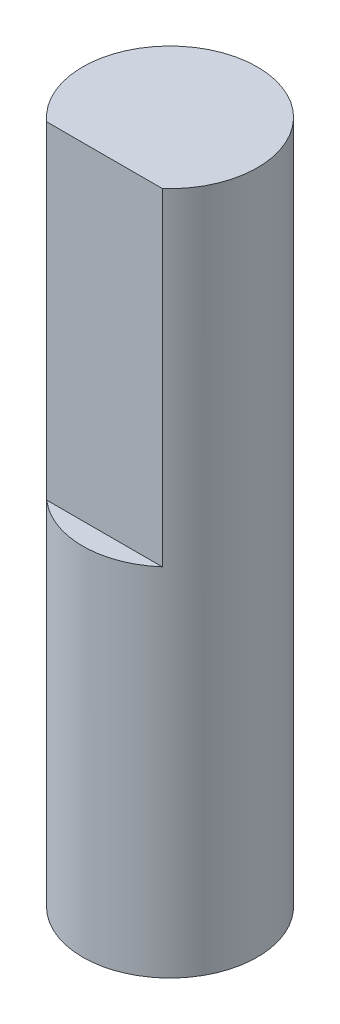
ISO-10303-21;
HEADER;
FILE_DESCRIPTION(('STEP AP214'),'2;1');
FILE_NAME('part.step','',(''),(''),'','','');
FILE_SCHEMA(('AUTOMOTIVE_DESIGN { 1 0 10303 214 1 1 1 1 }'));
ENDSEC;
DATA;
#1=APPLICATION_CONTEXT('core data for automotive mechanical design processes');
#2=APPLICATION_PROTOCOL_DEFINITION('international standard','automotive_design',2000,#1);
#3=PRODUCT_CONTEXT('',#1,'mechanical');
#4=PRODUCT('Part','Part','',(#3));
#5=PRODUCT_RELATED_PRODUCT_CATEGORY('part','',(#4));
#6=PRODUCT_DEFINITION_FORMATION('','',#4);
#7=PRODUCT_DEFINITION_CONTEXT('part definition',#1,'design');
#8=PRODUCT_DEFINITION('design','',#6,#7);
#9=PRODUCT_DEFINITION_SHAPE('','',#8);
#10=(LENGTH_UNIT() NAMED_UNIT(*) SI_UNIT(.MILLI.,.METRE.));
#11=(NAMED_UNIT(*) PLANE_ANGLE_UNIT() SI_UNIT($,.RADIAN.));
#12=(NAMED_UNIT(*) SI_UNIT($,.STERADIAN.) SOLID_ANGLE_UNIT());
#13=UNCERTAINTY_MEASURE_WITH_UNIT(LENGTH_MEASURE(1.E-05),#10,'distance_accuracy_value','');
#14=(GEOMETRIC_REPRESENTATION_CONTEXT(3) GLOBAL_UNCERTAINTY_ASSIGNED_CONTEXT((#13)) GLOBAL_UNIT_ASSIGNED_CONTEXT((#10,
#11,#12)) REPRESENTATION_CONTEXT('',''));
#15=CARTESIAN_POINT('',(0.,0.,0.));
#16=DIRECTION('',(0.,0.,1.));
#17=DIRECTION('',(1.,0.,0.));
#18=AXIS2_PLACEMENT_3D('',#15,#16,#17);
#19=CARTESIAN_POINT('',(0.,31.3,0.));
#20=DIRECTION('',(0.,-1.,0.));
#21=DIRECTION('',(0.,0.,-1.));
#22=AXIS2_PLACEMENT_3D('',#19,#20,#21);
#23=CYLINDRICAL_SURFACE('',#22,4.);
#24=CARTESIAN_POINT('',(0.,31.3,0.));
#25=DIRECTION('',(0.,1.,0.));
#26=DIRECTION('',(0.,0.,1.));
#27=AXIS2_PLACEMENT_3D('',#24,#25,#26);
#28=CIRCLE('',#27,4.);
#29=CARTESIAN_POINT('',(2.64575131106459,31.3,3.));
#30=VERTEX_POINT('',#29);
#31=CARTESIAN_POINT('',(-2.64575131106459,31.3,3.));
#32=VERTEX_POINT('',#31);
#33=EDGE_CURVE('E11',#30,#32,#28,.T.);
#34=ORIENTED_EDGE('',*,*,#33,.F.);
#35=DIRECTION('',(0.,1.,0.));
#36=VECTOR('',#35,1.);
#37=CARTESIAN_POINT('',(2.64575131106459,16.3,3.));
#38=LINE('',#37,#36);
#39=CARTESIAN_POINT('',(2.64575131106459,16.3,3.));
#40=VERTEX_POINT('',#39);
#41=EDGE_CURVE('E53',#40,#30,#38,.T.);
#42=ORIENTED_EDGE('',*,*,#41,.F.);
#43=CARTESIAN_POINT('',(0.,16.3,0.));
#44=DIRECTION('',(0.,1.,0.));
#45=DIRECTION('',(0.,0.,1.));
#46=AXIS2_PLACEMENT_3D('',#43,#44,#45);
#47=CIRCLE('',#46,4.);
#48=CARTESIAN_POINT('',(-2.64575131106459,16.3,3.));
#49=VERTEX_POINT('',#48);
#50=EDGE_CURVE('E68',#49,#40,#47,.T.);
#51=ORIENTED_EDGE('',*,*,#50,.F.);
#52=DIRECTION('',(0.,1.,0.));
#53=VECTOR('',#52,1.);
#54=CARTESIAN_POINT('',(-2.64575131106459,16.3,3.));
#55=LINE('',#54,#53);
#56=EDGE_CURVE('E59',#49,#32,#55,.T.);
#57=ORIENTED_EDGE('',*,*,#56,.T.);
#58=EDGE_LOOP('',(#34,#42,#51,#57));
#59=FACE_BOUND('',#58,.T.);
#60=CARTESIAN_POINT('',(0.,0.,0.));
#61=DIRECTION('',(0.,1.,0.));
#62=DIRECTION('',(0.,0.,1.));
#63=AXIS2_PLACEMENT_3D('',#60,#61,#62);
#64=CIRCLE('',#63,4.);
#65=CARTESIAN_POINT('',(0.,0.,4.));
#66=VERTEX_POINT('',#65);
#67=EDGE_CURVE('E42',#66,#66,#64,.T.);
#68=ORIENTED_EDGE('',*,*,#67,.T.);
#69=EDGE_LOOP('',(#68));
#70=FACE_BOUND('',#69,.T.);
#71=ADVANCED_FACE('F39',(#59,#70),#23,.T.);
#72=CARTESIAN_POINT('',(0.,31.3,0.));
#73=DIRECTION('',(0.,1.,0.));
#74=DIRECTION('',(0.,0.,1.));
#75=AXIS2_PLACEMENT_3D('',#72,#73,#74);
#76=PLANE('',#75);
#77=DIRECTION('',(-1.,0.,0.));
#78=VECTOR('',#77,1.);
#79=CARTESIAN_POINT('',(-2.64575131106459,31.3,3.));
#80=LINE('',#79,#78);
#81=EDGE_CURVE('E64',#30,#32,#80,.T.);
#82=ORIENTED_EDGE('',*,*,#81,.F.);
#83=ORIENTED_EDGE('',*,*,#33,.T.);
#84=EDGE_LOOP('',(#82,#83));
#85=FACE_BOUND('',#84,.T.);
#86=ADVANCED_FACE('F74',(#85),#76,.T.);
#87=CARTESIAN_POINT('',(0.,0.,0.));
#88=DIRECTION('',(0.,1.,0.));
#89=DIRECTION('',(0.,0.,1.));
#90=AXIS2_PLACEMENT_3D('',#87,#88,#89);
#91=PLANE('',#90);
#92=ORIENTED_EDGE('',*,*,#67,.F.);
#93=EDGE_LOOP('',(#92));
#94=FACE_BOUND('',#93,.T.);
#95=ADVANCED_FACE('F76',(#94),#91,.F.);
#96=CARTESIAN_POINT('',(-2.64575131106459,16.3,3.));
#97=DIRECTION('',(0.,0.,-1.));
#98=DIRECTION('',(-1.,0.,0.));
#99=AXIS2_PLACEMENT_3D('',#96,#97,#98);
#100=PLANE('',#99);
#101=ORIENTED_EDGE('',*,*,#81,.T.);
#102=ORIENTED_EDGE('',*,*,#56,.F.);
#103=DIRECTION('',(-1.,0.,0.));
#104=VECTOR('',#103,1.);
#105=CARTESIAN_POINT('',(-2.64575131106459,16.3,3.));
#106=LINE('',#105,#104);
#107=EDGE_CURVE('E91',#40,#49,#106,.T.);
#108=ORIENTED_EDGE('',*,*,#107,.F.);
#109=ORIENTED_EDGE('',*,*,#41,.T.);
#110=EDGE_LOOP('',(#101,#102,#108,#109));
#111=FACE_BOUND('',#110,.T.);
#112=ADVANCED_FACE('F65',(#111),#100,.F.);
#113=CARTESIAN_POINT('',(0.,16.3,0.));
#114=DIRECTION('',(0.,1.,0.));
#115=DIRECTION('',(0.,0.,1.));
#116=AXIS2_PLACEMENT_3D('',#113,#114,#115);
#117=PLANE('',#116);
#118=ORIENTED_EDGE('',*,*,#50,.T.);
#119=ORIENTED_EDGE('',*,*,#107,.T.);
#120=EDGE_LOOP('',(#118,#119));
#121=FACE_BOUND('',#120,.T.);
#122=ADVANCED_FACE('F86',(#121),#117,.T.);
#123=CLOSED_SHELL('',(#71,#86,#95,#112,#122));
#124=MANIFOLD_SOLID_BREP('B2',#123);
#125=ADVANCED_BREP_SHAPE_REPRESENTATION('',(#18,#124),#14);
#126=SHAPE_DEFINITION_REPRESENTATION(#9,#125);
ENDSEC;
END-ISO-10303-21;
